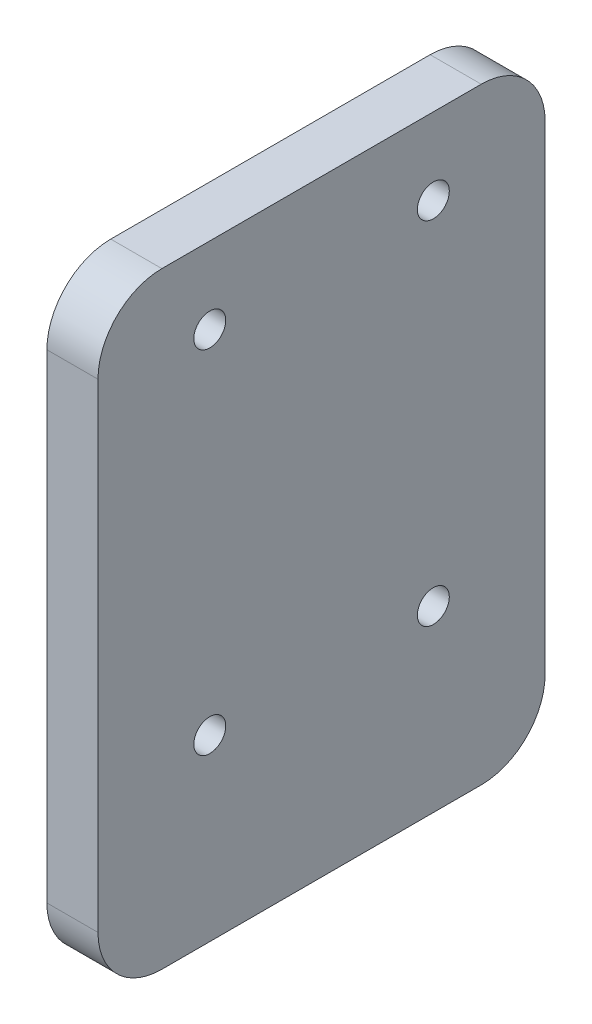
ISO-10303-21;
HEADER;
FILE_DESCRIPTION(('STEP AP214'),'2;1');
FILE_NAME('part.step','',(''),(''),'','','');
FILE_SCHEMA(('AUTOMOTIVE_DESIGN { 1 0 10303 214 1 1 1 1 }'));
ENDSEC;
DATA;
#1=APPLICATION_CONTEXT('core data for automotive mechanical design processes');
#2=APPLICATION_PROTOCOL_DEFINITION('international standard','automotive_design',2000,#1);
#3=PRODUCT_CONTEXT('',#1,'mechanical');
#4=PRODUCT('Part','Part','',(#3));
#5=PRODUCT_RELATED_PRODUCT_CATEGORY('part','',(#4));
#6=PRODUCT_DEFINITION_FORMATION('','',#4);
#7=PRODUCT_DEFINITION_CONTEXT('part definition',#1,'design');
#8=PRODUCT_DEFINITION('design','',#6,#7);
#9=PRODUCT_DEFINITION_SHAPE('','',#8);
#10=(LENGTH_UNIT() NAMED_UNIT(*) SI_UNIT(.MILLI.,.METRE.));
#11=(NAMED_UNIT(*) PLANE_ANGLE_UNIT() SI_UNIT($,.RADIAN.));
#12=(NAMED_UNIT(*) SI_UNIT($,.STERADIAN.) SOLID_ANGLE_UNIT());
#13=UNCERTAINTY_MEASURE_WITH_UNIT(LENGTH_MEASURE(1.E-05),#10,'distance_accuracy_value','');
#14=(GEOMETRIC_REPRESENTATION_CONTEXT(3) GLOBAL_UNCERTAINTY_ASSIGNED_CONTEXT((#13)) GLOBAL_UNIT_ASSIGNED_CONTEXT((#10,
#11,#12)) REPRESENTATION_CONTEXT('',''));
#15=CARTESIAN_POINT('',(0.,0.,0.));
#16=DIRECTION('',(0.,0.,1.));
#17=DIRECTION('',(1.,0.,0.));
#18=AXIS2_PLACEMENT_3D('',#15,#16,#17);
#19=CARTESIAN_POINT('',(8.,47.5,35.));
#20=DIRECTION('',(0.,0.,-1.));
#21=DIRECTION('',(0.,1.,0.));
#22=AXIS2_PLACEMENT_3D('',#19,#20,#21);
#23=PLANE('',#22);
#24=DIRECTION('',(0.,-1.,0.));
#25=VECTOR('',#24,1.);
#26=CARTESIAN_POINT('',(0.,47.5,35.));
#27=LINE('',#26,#25);
#28=CARTESIAN_POINT('',(0.,37.5,35.));
#29=VERTEX_POINT('',#28);
#30=CARTESIAN_POINT('',(0.,-37.5,35.));
#31=VERTEX_POINT('',#30);
#32=EDGE_CURVE('E129',#29,#31,#27,.T.);
#33=ORIENTED_EDGE('',*,*,#32,.T.);
#34=DIRECTION('',(-1.,0.,0.));
#35=VECTOR('',#34,1.);
#36=CARTESIAN_POINT('',(8.,-37.5,35.));
#37=LINE('',#36,#35);
#38=CARTESIAN_POINT('',(8.,-37.5,35.));
#39=VERTEX_POINT('',#38);
#40=EDGE_CURVE('E107',#31,#39,#37,.F.);
#41=ORIENTED_EDGE('',*,*,#40,.T.);
#42=DIRECTION('',(0.,-1.,0.));
#43=VECTOR('',#42,1.);
#44=CARTESIAN_POINT('',(8.,47.5,35.));
#45=LINE('',#44,#43);
#46=CARTESIAN_POINT('',(8.,37.5,35.));
#47=VERTEX_POINT('',#46);
#48=EDGE_CURVE('E139',#47,#39,#45,.T.);
#49=ORIENTED_EDGE('',*,*,#48,.F.);
#50=DIRECTION('',(-1.,0.,0.));
#51=VECTOR('',#50,1.);
#52=CARTESIAN_POINT('',(8.,37.5,35.));
#53=LINE('',#52,#51);
#54=EDGE_CURVE('E112',#47,#29,#53,.T.);
#55=ORIENTED_EDGE('',*,*,#54,.T.);
#56=EDGE_LOOP('',(#33,#41,#49,#55));
#57=FACE_BOUND('',#56,.T.);
#58=ADVANCED_FACE('F36',(#57),#23,.F.);
#59=CARTESIAN_POINT('',(8.,-47.5,35.));
#60=DIRECTION('',(0.,1.,0.));
#61=DIRECTION('',(0.,0.,1.));
#62=AXIS2_PLACEMENT_3D('',#59,#60,#61);
#63=PLANE('',#62);
#64=DIRECTION('',(0.,0.,-1.));
#65=VECTOR('',#64,1.);
#66=CARTESIAN_POINT('',(8.,-47.5,35.));
#67=LINE('',#66,#65);
#68=CARTESIAN_POINT('',(8.,-47.5,25.));
#69=VERTEX_POINT('',#68);
#70=CARTESIAN_POINT('',(8.,-47.5,-25.));
#71=VERTEX_POINT('',#70);
#72=EDGE_CURVE('E122',#69,#71,#67,.T.);
#73=ORIENTED_EDGE('',*,*,#72,.F.);
#74=DIRECTION('',(-1.,0.,0.));
#75=VECTOR('',#74,1.);
#76=CARTESIAN_POINT('',(8.,-47.5,25.));
#77=LINE('',#76,#75);
#78=CARTESIAN_POINT('',(0.,-47.5,25.));
#79=VERTEX_POINT('',#78);
#80=EDGE_CURVE('E106',#69,#79,#77,.T.);
#81=ORIENTED_EDGE('',*,*,#80,.T.);
#82=DIRECTION('',(0.,0.,-1.));
#83=VECTOR('',#82,1.);
#84=CARTESIAN_POINT('',(0.,-47.5,35.));
#85=LINE('',#84,#83);
#86=CARTESIAN_POINT('',(0.,-47.5,-25.));
#87=VERTEX_POINT('',#86);
#88=EDGE_CURVE('E119',#79,#87,#85,.T.);
#89=ORIENTED_EDGE('',*,*,#88,.T.);
#90=DIRECTION('',(-1.,0.,0.));
#91=VECTOR('',#90,1.);
#92=CARTESIAN_POINT('',(8.,-47.5,-25.));
#93=LINE('',#92,#91);
#94=EDGE_CURVE('E124',#87,#71,#93,.F.);
#95=ORIENTED_EDGE('',*,*,#94,.T.);
#96=EDGE_LOOP('',(#73,#81,#89,#95));
#97=FACE_BOUND('',#96,.T.);
#98=ADVANCED_FACE('F118',(#97),#63,.F.);
#99=CARTESIAN_POINT('',(8.,47.5,-35.));
#100=DIRECTION('',(0.,0.,1.));
#101=DIRECTION('',(0.,-1.,0.));
#102=AXIS2_PLACEMENT_3D('',#99,#100,#101);
#103=PLANE('',#102);
#104=DIRECTION('',(0.,1.,0.));
#105=VECTOR('',#104,1.);
#106=CARTESIAN_POINT('',(8.,47.5,-35.));
#107=LINE('',#106,#105);
#108=CARTESIAN_POINT('',(8.,-37.5,-35.));
#109=VERTEX_POINT('',#108);
#110=CARTESIAN_POINT('',(8.,37.5,-35.));
#111=VERTEX_POINT('',#110);
#112=EDGE_CURVE('E170',#109,#111,#107,.T.);
#113=ORIENTED_EDGE('',*,*,#112,.F.);
#114=DIRECTION('',(-1.,0.,0.));
#115=VECTOR('',#114,1.);
#116=CARTESIAN_POINT('',(8.,-37.5,-35.));
#117=LINE('',#116,#115);
#118=CARTESIAN_POINT('',(0.,-37.5,-35.));
#119=VERTEX_POINT('',#118);
#120=EDGE_CURVE('E163',#109,#119,#117,.T.);
#121=ORIENTED_EDGE('',*,*,#120,.T.);
#122=DIRECTION('',(0.,1.,0.));
#123=VECTOR('',#122,1.);
#124=CARTESIAN_POINT('',(0.,47.5,-35.));
#125=LINE('',#124,#123);
#126=CARTESIAN_POINT('',(0.,37.5,-35.));
#127=VERTEX_POINT('',#126);
#128=EDGE_CURVE('E128',#119,#127,#125,.T.);
#129=ORIENTED_EDGE('',*,*,#128,.T.);
#130=DIRECTION('',(-1.,0.,0.));
#131=VECTOR('',#130,1.);
#132=CARTESIAN_POINT('',(8.,37.5,-35.));
#133=LINE('',#132,#131);
#134=EDGE_CURVE('E161',#127,#111,#133,.F.);
#135=ORIENTED_EDGE('',*,*,#134,.T.);
#136=EDGE_LOOP('',(#113,#121,#129,#135));
#137=FACE_BOUND('',#136,.T.);
#138=ADVANCED_FACE('F168',(#137),#103,.F.);
#139=CARTESIAN_POINT('',(8.,47.5,35.));
#140=DIRECTION('',(0.,-1.,0.));
#141=DIRECTION('',(0.,0.,-1.));
#142=AXIS2_PLACEMENT_3D('',#139,#140,#141);
#143=PLANE('',#142);
#144=DIRECTION('',(0.,0.,1.));
#145=VECTOR('',#144,1.);
#146=CARTESIAN_POINT('',(8.,47.5,35.));
#147=LINE('',#146,#145);
#148=CARTESIAN_POINT('',(8.,47.5,-25.));
#149=VERTEX_POINT('',#148);
#150=CARTESIAN_POINT('',(8.,47.5,25.));
#151=VERTEX_POINT('',#150);
#152=EDGE_CURVE('E145',#149,#151,#147,.T.);
#153=ORIENTED_EDGE('',*,*,#152,.F.);
#154=DIRECTION('',(-1.,0.,0.));
#155=VECTOR('',#154,1.);
#156=CARTESIAN_POINT('',(8.,47.5,-25.));
#157=LINE('',#156,#155);
#158=CARTESIAN_POINT('',(0.,47.5,-25.));
#159=VERTEX_POINT('',#158);
#160=EDGE_CURVE('E11',#149,#159,#157,.T.);
#161=ORIENTED_EDGE('',*,*,#160,.T.);
#162=DIRECTION('',(0.,0.,1.));
#163=VECTOR('',#162,1.);
#164=CARTESIAN_POINT('',(0.,47.5,35.));
#165=LINE('',#164,#163);
#166=CARTESIAN_POINT('',(0.,47.5,25.));
#167=VERTEX_POINT('',#166);
#168=EDGE_CURVE('E132',#159,#167,#165,.T.);
#169=ORIENTED_EDGE('',*,*,#168,.T.);
#170=DIRECTION('',(-1.,0.,0.));
#171=VECTOR('',#170,1.);
#172=CARTESIAN_POINT('',(8.,47.5,25.));
#173=LINE('',#172,#171);
#174=EDGE_CURVE('E44',#167,#151,#173,.F.);
#175=ORIENTED_EDGE('',*,*,#174,.T.);
#176=EDGE_LOOP('',(#153,#161,#169,#175));
#177=FACE_BOUND('',#176,.T.);
#178=ADVANCED_FACE('F177',(#177),#143,.F.);
#179=CARTESIAN_POINT('',(8.,0.,0.));
#180=DIRECTION('',(1.,0.,0.));
#181=DIRECTION('',(0.,0.,-1.));
#182=AXIS2_PLACEMENT_3D('',#179,#180,#181);
#183=PLANE('',#182);
#184=CARTESIAN_POINT('',(8.,35.5,17.5));
#185=DIRECTION('',(1.,0.,0.));
#186=DIRECTION('',(0.,0.,-1.));
#187=AXIS2_PLACEMENT_3D('',#184,#185,#186);
#188=CIRCLE('',#187,2.5);
#189=CARTESIAN_POINT('',(8.,35.5,15.));
#190=VERTEX_POINT('',#189);
#191=EDGE_CURVE('E199',#190,#190,#188,.T.);
#192=ORIENTED_EDGE('',*,*,#191,.F.);
#193=EDGE_LOOP('',(#192));
#194=FACE_BOUND('',#193,.T.);
#195=CARTESIAN_POINT('',(8.,35.5,-17.5));
#196=DIRECTION('',(1.,0.,0.));
#197=DIRECTION('',(0.,0.,-1.));
#198=AXIS2_PLACEMENT_3D('',#195,#196,#197);
#199=CIRCLE('',#198,2.5);
#200=CARTESIAN_POINT('',(8.,35.5,-20.));
#201=VERTEX_POINT('',#200);
#202=EDGE_CURVE('E144',#201,#201,#199,.T.);
#203=ORIENTED_EDGE('',*,*,#202,.F.);
#204=EDGE_LOOP('',(#203));
#205=FACE_BOUND('',#204,.T.);
#206=CARTESIAN_POINT('',(8.,-19.5,17.5));
#207=DIRECTION('',(1.,0.,0.));
#208=DIRECTION('',(0.,0.,-1.));
#209=AXIS2_PLACEMENT_3D('',#206,#207,#208);
#210=CIRCLE('',#209,2.5);
#211=CARTESIAN_POINT('',(8.,-19.5,15.));
#212=VERTEX_POINT('',#211);
#213=EDGE_CURVE('E143',#212,#212,#210,.T.);
#214=ORIENTED_EDGE('',*,*,#213,.F.);
#215=EDGE_LOOP('',(#214));
#216=FACE_BOUND('',#215,.T.);
#217=CARTESIAN_POINT('',(8.,-19.5,-17.5));
#218=DIRECTION('',(1.,0.,0.));
#219=DIRECTION('',(0.,0.,-1.));
#220=AXIS2_PLACEMENT_3D('',#217,#218,#219);
#221=CIRCLE('',#220,2.5);
#222=CARTESIAN_POINT('',(8.,-19.5,-20.));
#223=VERTEX_POINT('',#222);
#224=EDGE_CURVE('E186',#223,#223,#221,.T.);
#225=ORIENTED_EDGE('',*,*,#224,.F.);
#226=EDGE_LOOP('',(#225));
#227=FACE_BOUND('',#226,.T.);
#228=ORIENTED_EDGE('',*,*,#48,.T.);
#229=CARTESIAN_POINT('',(8.,-37.5,25.));
#230=DIRECTION('',(1.,0.,0.));
#231=DIRECTION('',(0.,0.,-1.));
#232=AXIS2_PLACEMENT_3D('',#229,#230,#231);
#233=CIRCLE('',#232,10.);
#234=EDGE_CURVE('E159',#39,#69,#233,.T.);
#235=ORIENTED_EDGE('',*,*,#234,.T.);
#236=ORIENTED_EDGE('',*,*,#72,.T.);
#237=CARTESIAN_POINT('',(8.,-37.5,-25.));
#238=DIRECTION('',(1.,0.,0.));
#239=DIRECTION('',(0.,0.,-1.));
#240=AXIS2_PLACEMENT_3D('',#237,#238,#239);
#241=CIRCLE('',#240,10.);
#242=EDGE_CURVE('E157',#71,#109,#241,.T.);
#243=ORIENTED_EDGE('',*,*,#242,.T.);
#244=ORIENTED_EDGE('',*,*,#112,.T.);
#245=CARTESIAN_POINT('',(8.,37.5,-25.));
#246=DIRECTION('',(1.,0.,0.));
#247=DIRECTION('',(0.,0.,-1.));
#248=AXIS2_PLACEMENT_3D('',#245,#246,#247);
#249=CIRCLE('',#248,10.);
#250=EDGE_CURVE('E57',#111,#149,#249,.T.);
#251=ORIENTED_EDGE('',*,*,#250,.T.);
#252=ORIENTED_EDGE('',*,*,#152,.T.);
#253=CARTESIAN_POINT('',(8.,37.5,25.));
#254=DIRECTION('',(1.,0.,0.));
#255=DIRECTION('',(0.,0.,-1.));
#256=AXIS2_PLACEMENT_3D('',#253,#254,#255);
#257=CIRCLE('',#256,10.);
#258=EDGE_CURVE('E154',#151,#47,#257,.T.);
#259=ORIENTED_EDGE('',*,*,#258,.T.);
#260=EDGE_LOOP('',(#228,#235,#236,#243,#244,#251,#252,#259));
#261=FACE_BOUND('',#260,.T.);
#262=ADVANCED_FACE('F206',(#194,#205,#216,#227,#261),#183,.T.);
#263=CARTESIAN_POINT('',(0.,0.,0.));
#264=DIRECTION('',(1.,0.,0.));
#265=DIRECTION('',(0.,0.,-1.));
#266=AXIS2_PLACEMENT_3D('',#263,#264,#265);
#267=PLANE('',#266);
#268=CARTESIAN_POINT('',(0.,35.5,17.5));
#269=DIRECTION('',(1.,0.,0.));
#270=DIRECTION('',(0.,0.,-1.));
#271=AXIS2_PLACEMENT_3D('',#268,#269,#270);
#272=CIRCLE('',#271,2.5);
#273=CARTESIAN_POINT('',(0.,35.5,15.));
#274=VERTEX_POINT('',#273);
#275=EDGE_CURVE('E196',#274,#274,#272,.T.);
#276=ORIENTED_EDGE('',*,*,#275,.T.);
#277=EDGE_LOOP('',(#276));
#278=FACE_BOUND('',#277,.T.);
#279=CARTESIAN_POINT('',(0.,35.5,-17.5));
#280=DIRECTION('',(1.,0.,0.));
#281=DIRECTION('',(0.,0.,-1.));
#282=AXIS2_PLACEMENT_3D('',#279,#280,#281);
#283=CIRCLE('',#282,2.5);
#284=CARTESIAN_POINT('',(0.,35.5,-20.));
#285=VERTEX_POINT('',#284);
#286=EDGE_CURVE('E140',#285,#285,#283,.T.);
#287=ORIENTED_EDGE('',*,*,#286,.T.);
#288=EDGE_LOOP('',(#287));
#289=FACE_BOUND('',#288,.T.);
#290=CARTESIAN_POINT('',(0.,-19.5,17.5));
#291=DIRECTION('',(1.,0.,0.));
#292=DIRECTION('',(0.,0.,-1.));
#293=AXIS2_PLACEMENT_3D('',#290,#291,#292);
#294=CIRCLE('',#293,2.5);
#295=CARTESIAN_POINT('',(0.,-19.5,15.));
#296=VERTEX_POINT('',#295);
#297=EDGE_CURVE('E189',#296,#296,#294,.T.);
#298=ORIENTED_EDGE('',*,*,#297,.T.);
#299=EDGE_LOOP('',(#298));
#300=FACE_BOUND('',#299,.T.);
#301=CARTESIAN_POINT('',(0.,-19.5,-17.5));
#302=DIRECTION('',(1.,0.,0.));
#303=DIRECTION('',(0.,0.,-1.));
#304=AXIS2_PLACEMENT_3D('',#301,#302,#303);
#305=CIRCLE('',#304,2.5);
#306=CARTESIAN_POINT('',(0.,-19.5,-20.));
#307=VERTEX_POINT('',#306);
#308=EDGE_CURVE('E134',#307,#307,#305,.T.);
#309=ORIENTED_EDGE('',*,*,#308,.T.);
#310=EDGE_LOOP('',(#309));
#311=FACE_BOUND('',#310,.T.);
#312=ORIENTED_EDGE('',*,*,#88,.F.);
#313=CARTESIAN_POINT('',(0.,-37.5,25.));
#314=DIRECTION('',(1.,0.,0.));
#315=DIRECTION('',(0.,0.,-1.));
#316=AXIS2_PLACEMENT_3D('',#313,#314,#315);
#317=CIRCLE('',#316,10.);
#318=EDGE_CURVE('E102',#79,#31,#317,.F.);
#319=ORIENTED_EDGE('',*,*,#318,.T.);
#320=ORIENTED_EDGE('',*,*,#32,.F.);
#321=CARTESIAN_POINT('',(0.,37.5,25.));
#322=DIRECTION('',(1.,0.,0.));
#323=DIRECTION('',(0.,0.,-1.));
#324=AXIS2_PLACEMENT_3D('',#321,#322,#323);
#325=CIRCLE('',#324,10.);
#326=EDGE_CURVE('E123',#29,#167,#325,.F.);
#327=ORIENTED_EDGE('',*,*,#326,.T.);
#328=ORIENTED_EDGE('',*,*,#168,.F.);
#329=CARTESIAN_POINT('',(0.,37.5,-25.));
#330=DIRECTION('',(1.,0.,0.));
#331=DIRECTION('',(0.,0.,-1.));
#332=AXIS2_PLACEMENT_3D('',#329,#330,#331);
#333=CIRCLE('',#332,10.);
#334=EDGE_CURVE('E148',#159,#127,#333,.F.);
#335=ORIENTED_EDGE('',*,*,#334,.T.);
#336=ORIENTED_EDGE('',*,*,#128,.F.);
#337=CARTESIAN_POINT('',(0.,-37.5,-25.));
#338=DIRECTION('',(1.,0.,0.));
#339=DIRECTION('',(0.,0.,-1.));
#340=AXIS2_PLACEMENT_3D('',#337,#338,#339);
#341=CIRCLE('',#340,10.);
#342=EDGE_CURVE('E113',#119,#87,#341,.F.);
#343=ORIENTED_EDGE('',*,*,#342,.T.);
#344=EDGE_LOOP('',(#312,#319,#320,#327,#328,#335,#336,#343));
#345=FACE_BOUND('',#344,.T.);
#346=ADVANCED_FACE('F126',(#278,#289,#300,#311,#345),#267,.F.);
#347=CARTESIAN_POINT('',(8.,-19.5,-17.5));
#348=DIRECTION('',(1.,0.,0.));
#349=DIRECTION('',(0.,0.,-1.));
#350=AXIS2_PLACEMENT_3D('',#347,#348,#349);
#351=CYLINDRICAL_SURFACE('',#350,2.5);
#352=ORIENTED_EDGE('',*,*,#224,.T.);
#353=EDGE_LOOP('',(#352));
#354=FACE_BOUND('',#353,.T.);
#355=ORIENTED_EDGE('',*,*,#308,.F.);
#356=EDGE_LOOP('',(#355));
#357=FACE_BOUND('',#356,.T.);
#358=ADVANCED_FACE('F283',(#354,#357),#351,.F.);
#359=CARTESIAN_POINT('',(8.,-19.5,17.5));
#360=DIRECTION('',(1.,0.,0.));
#361=DIRECTION('',(0.,0.,-1.));
#362=AXIS2_PLACEMENT_3D('',#359,#360,#361);
#363=CYLINDRICAL_SURFACE('',#362,2.5);
#364=ORIENTED_EDGE('',*,*,#213,.T.);
#365=EDGE_LOOP('',(#364));
#366=FACE_BOUND('',#365,.T.);
#367=ORIENTED_EDGE('',*,*,#297,.F.);
#368=EDGE_LOOP('',(#367));
#369=FACE_BOUND('',#368,.T.);
#370=ADVANCED_FACE('F273',(#366,#369),#363,.F.);
#371=CARTESIAN_POINT('',(8.,35.5,-17.5));
#372=DIRECTION('',(1.,0.,0.));
#373=DIRECTION('',(0.,0.,-1.));
#374=AXIS2_PLACEMENT_3D('',#371,#372,#373);
#375=CYLINDRICAL_SURFACE('',#374,2.5);
#376=ORIENTED_EDGE('',*,*,#202,.T.);
#377=EDGE_LOOP('',(#376));
#378=FACE_BOUND('',#377,.T.);
#379=ORIENTED_EDGE('',*,*,#286,.F.);
#380=EDGE_LOOP('',(#379));
#381=FACE_BOUND('',#380,.T.);
#382=ADVANCED_FACE('F264',(#378,#381),#375,.F.);
#383=CARTESIAN_POINT('',(8.,35.5,17.5));
#384=DIRECTION('',(1.,0.,0.));
#385=DIRECTION('',(0.,0.,-1.));
#386=AXIS2_PLACEMENT_3D('',#383,#384,#385);
#387=CYLINDRICAL_SURFACE('',#386,2.5);
#388=ORIENTED_EDGE('',*,*,#191,.T.);
#389=EDGE_LOOP('',(#388));
#390=FACE_BOUND('',#389,.T.);
#391=ORIENTED_EDGE('',*,*,#275,.F.);
#392=EDGE_LOOP('',(#391));
#393=FACE_BOUND('',#392,.T.);
#394=ADVANCED_FACE('F203',(#390,#393),#387,.F.);
#395=CARTESIAN_POINT('',(8.,-37.5,25.));
#396=DIRECTION('',(-1.,0.,0.));
#397=DIRECTION('',(0.,0.,1.));
#398=AXIS2_PLACEMENT_3D('',#395,#396,#397);
#399=CYLINDRICAL_SURFACE('',#398,10.);
#400=ORIENTED_EDGE('',*,*,#234,.F.);
#401=ORIENTED_EDGE('',*,*,#40,.F.);
#402=ORIENTED_EDGE('',*,*,#318,.F.);
#403=ORIENTED_EDGE('',*,*,#80,.F.);
#404=EDGE_LOOP('',(#400,#401,#402,#403));
#405=FACE_BOUND('',#404,.T.);
#406=ADVANCED_FACE('F105',(#405),#399,.T.);
#407=CARTESIAN_POINT('',(8.,-37.5,-25.));
#408=DIRECTION('',(-1.,0.,0.));
#409=DIRECTION('',(0.,0.,1.));
#410=AXIS2_PLACEMENT_3D('',#407,#408,#409);
#411=CYLINDRICAL_SURFACE('',#410,10.);
#412=ORIENTED_EDGE('',*,*,#242,.F.);
#413=ORIENTED_EDGE('',*,*,#94,.F.);
#414=ORIENTED_EDGE('',*,*,#342,.F.);
#415=ORIENTED_EDGE('',*,*,#120,.F.);
#416=EDGE_LOOP('',(#412,#413,#414,#415));
#417=FACE_BOUND('',#416,.T.);
#418=ADVANCED_FACE('F223',(#417),#411,.T.);
#419=CARTESIAN_POINT('',(8.,37.5,-25.));
#420=DIRECTION('',(-1.,0.,0.));
#421=DIRECTION('',(0.,0.,1.));
#422=AXIS2_PLACEMENT_3D('',#419,#420,#421);
#423=CYLINDRICAL_SURFACE('',#422,10.);
#424=ORIENTED_EDGE('',*,*,#250,.F.);
#425=ORIENTED_EDGE('',*,*,#134,.F.);
#426=ORIENTED_EDGE('',*,*,#334,.F.);
#427=ORIENTED_EDGE('',*,*,#160,.F.);
#428=EDGE_LOOP('',(#424,#425,#426,#427));
#429=FACE_BOUND('',#428,.T.);
#430=ADVANCED_FACE('F176',(#429),#423,.T.);
#431=CARTESIAN_POINT('',(8.,37.5,25.));
#432=DIRECTION('',(-1.,0.,0.));
#433=DIRECTION('',(0.,0.,1.));
#434=AXIS2_PLACEMENT_3D('',#431,#432,#433);
#435=CYLINDRICAL_SURFACE('',#434,10.);
#436=ORIENTED_EDGE('',*,*,#258,.F.);
#437=ORIENTED_EDGE('',*,*,#174,.F.);
#438=ORIENTED_EDGE('',*,*,#326,.F.);
#439=ORIENTED_EDGE('',*,*,#54,.F.);
#440=EDGE_LOOP('',(#436,#437,#438,#439));
#441=FACE_BOUND('',#440,.T.);
#442=ADVANCED_FACE('F38',(#441),#435,.T.);
#443=CLOSED_SHELL('',(#58,#98,#138,#178,#262,#346,#358,#370,#382,#394,#406,#418,#430,#442));
#444=MANIFOLD_SOLID_BREP('B2',#443);
#445=ADVANCED_BREP_SHAPE_REPRESENTATION('',(#18,#444),#14);
#446=SHAPE_DEFINITION_REPRESENTATION(#9,#445);
ENDSEC;
END-ISO-10303-21;
